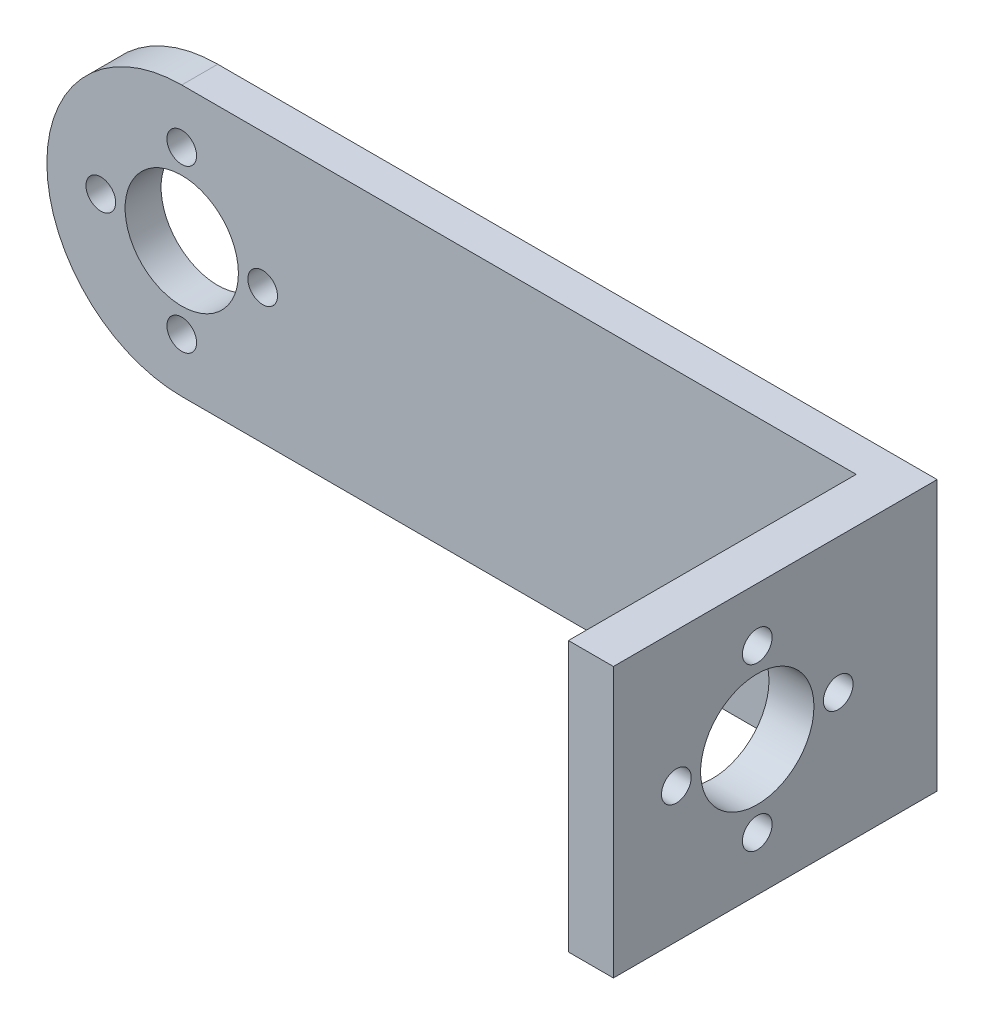
ISO-10303-21;
HEADER;
FILE_DESCRIPTION(('STEP AP214'),'2;1');
FILE_NAME('part.step','',(''),(''),'','','');
FILE_SCHEMA(('AUTOMOTIVE_DESIGN { 1 0 10303 214 1 1 1 1 }'));
ENDSEC;
DATA;
#1=APPLICATION_CONTEXT('core data for automotive mechanical design processes');
#2=APPLICATION_PROTOCOL_DEFINITION('international standard','automotive_design',2000,#1);
#3=PRODUCT_CONTEXT('',#1,'mechanical');
#4=PRODUCT('Part','Part','',(#3));
#5=PRODUCT_RELATED_PRODUCT_CATEGORY('part','',(#4));
#6=PRODUCT_DEFINITION_FORMATION('','',#4);
#7=PRODUCT_DEFINITION_CONTEXT('part definition',#1,'design');
#8=PRODUCT_DEFINITION('design','',#6,#7);
#9=PRODUCT_DEFINITION_SHAPE('','',#8);
#10=(LENGTH_UNIT() NAMED_UNIT(*) SI_UNIT(.MILLI.,.METRE.));
#11=(NAMED_UNIT(*) PLANE_ANGLE_UNIT() SI_UNIT($,.RADIAN.));
#12=(NAMED_UNIT(*) SI_UNIT($,.STERADIAN.) SOLID_ANGLE_UNIT());
#13=UNCERTAINTY_MEASURE_WITH_UNIT(LENGTH_MEASURE(1.E-05),#10,'distance_accuracy_value','');
#14=(GEOMETRIC_REPRESENTATION_CONTEXT(3) GLOBAL_UNCERTAINTY_ASSIGNED_CONTEXT((#13)) GLOBAL_UNIT_ASSIGNED_CONTEXT((#10,
#11,#12)) REPRESENTATION_CONTEXT('',''));
#15=CARTESIAN_POINT('',(0.,0.,0.));
#16=DIRECTION('',(0.,0.,1.));
#17=DIRECTION('',(1.,0.,0.));
#18=AXIS2_PLACEMENT_3D('',#15,#16,#17);
#19=CARTESIAN_POINT('',(0.,0.,4.));
#20=DIRECTION('',(0.,0.,1.));
#21=DIRECTION('',(1.,0.,0.));
#22=AXIS2_PLACEMENT_3D('',#19,#20,#21);
#23=PLANE('',#22);
#24=CARTESIAN_POINT('',(0.,9.,4.));
#25=DIRECTION('',(0.,0.,1.));
#26=DIRECTION('',(1.,0.,0.));
#27=AXIS2_PLACEMENT_3D('',#24,#25,#26);
#28=CIRCLE('',#27,1.65);
#29=CARTESIAN_POINT('',(1.65,9.,4.));
#30=VERTEX_POINT('',#29);
#31=EDGE_CURVE('E99',#30,#30,#28,.T.);
#32=ORIENTED_EDGE('',*,*,#31,.F.);
#33=EDGE_LOOP('',(#32));
#34=FACE_BOUND('',#33,.T.);
#35=CARTESIAN_POINT('',(9.,0.,4.));
#36=DIRECTION('',(0.,0.,1.));
#37=DIRECTION('',(1.,0.,0.));
#38=AXIS2_PLACEMENT_3D('',#35,#36,#37);
#39=CIRCLE('',#38,1.65);
#40=CARTESIAN_POINT('',(10.65,0.,4.));
#41=VERTEX_POINT('',#40);
#42=EDGE_CURVE('E156',#41,#41,#39,.T.);
#43=ORIENTED_EDGE('',*,*,#42,.F.);
#44=EDGE_LOOP('',(#43));
#45=FACE_BOUND('',#44,.T.);
#46=CARTESIAN_POINT('',(0.,-9.,4.));
#47=DIRECTION('',(0.,0.,1.));
#48=DIRECTION('',(1.,0.,0.));
#49=AXIS2_PLACEMENT_3D('',#46,#47,#48);
#50=CIRCLE('',#49,1.65);
#51=CARTESIAN_POINT('',(1.65,-9.,4.));
#52=VERTEX_POINT('',#51);
#53=EDGE_CURVE('E159',#52,#52,#50,.T.);
#54=ORIENTED_EDGE('',*,*,#53,.F.);
#55=EDGE_LOOP('',(#54));
#56=FACE_BOUND('',#55,.T.);
#57=CARTESIAN_POINT('',(0.,0.,4.));
#58=DIRECTION('',(0.,0.,1.));
#59=DIRECTION('',(1.,0.,0.));
#60=AXIS2_PLACEMENT_3D('',#57,#58,#59);
#61=CIRCLE('',#60,6.3);
#62=CARTESIAN_POINT('',(6.3,0.,4.));
#63=VERTEX_POINT('',#62);
#64=EDGE_CURVE('E162',#63,#63,#61,.T.);
#65=ORIENTED_EDGE('',*,*,#64,.F.);
#66=EDGE_LOOP('',(#65));
#67=FACE_BOUND('',#66,.T.);
#68=CARTESIAN_POINT('',(-9.,0.,4.));
#69=DIRECTION('',(0.,0.,1.));
#70=DIRECTION('',(1.,0.,0.));
#71=AXIS2_PLACEMENT_3D('',#68,#69,#70);
#72=CIRCLE('',#71,1.65);
#73=CARTESIAN_POINT('',(-7.35,0.,4.));
#74=VERTEX_POINT('',#73);
#75=EDGE_CURVE('E84',#74,#74,#72,.T.);
#76=ORIENTED_EDGE('',*,*,#75,.F.);
#77=EDGE_LOOP('',(#76));
#78=FACE_BOUND('',#77,.T.);
#79=DIRECTION('',(1.,0.,0.));
#80=VECTOR('',#79,1.);
#81=CARTESIAN_POINT('',(0.,-15.,4.));
#82=LINE('',#81,#80);
#83=CARTESIAN_POINT('',(0.,-15.,4.));
#84=VERTEX_POINT('',#83);
#85=CARTESIAN_POINT('',(75.,-15.,4.));
#86=VERTEX_POINT('',#85);
#87=EDGE_CURVE('E166',#84,#86,#82,.T.);
#88=ORIENTED_EDGE('',*,*,#87,.T.);
#89=DIRECTION('',(0.,1.,0.));
#90=VECTOR('',#89,1.);
#91=CARTESIAN_POINT('',(75.,0.,4.));
#92=LINE('',#91,#90);
#93=CARTESIAN_POINT('',(75.,15.,4.));
#94=VERTEX_POINT('',#93);
#95=EDGE_CURVE('E150',#86,#94,#92,.T.);
#96=ORIENTED_EDGE('',*,*,#95,.T.);
#97=DIRECTION('',(1.,0.,0.));
#98=VECTOR('',#97,1.);
#99=CARTESIAN_POINT('',(0.,15.,4.));
#100=LINE('',#99,#98);
#101=CARTESIAN_POINT('',(0.,15.,4.));
#102=VERTEX_POINT('',#101);
#103=EDGE_CURVE('E169',#102,#94,#100,.T.);
#104=ORIENTED_EDGE('',*,*,#103,.F.);
#105=CARTESIAN_POINT('',(0.,0.,4.));
#106=DIRECTION('',(0.,0.,1.));
#107=DIRECTION('',(1.,0.,0.));
#108=AXIS2_PLACEMENT_3D('',#105,#106,#107);
#109=CIRCLE('',#108,15.);
#110=EDGE_CURVE('E81',#102,#84,#109,.T.);
#111=ORIENTED_EDGE('',*,*,#110,.T.);
#112=EDGE_LOOP('',(#88,#96,#104,#111));
#113=FACE_BOUND('',#112,.T.);
#114=ADVANCED_FACE('F37',(#34,#45,#56,#67,#78,#113),#23,.T.);
#115=CARTESIAN_POINT('',(0.,0.,4.));
#116=DIRECTION('',(0.,0.,-1.));
#117=DIRECTION('',(-1.,0.,0.));
#118=AXIS2_PLACEMENT_3D('',#115,#116,#117);
#119=CYLINDRICAL_SURFACE('',#118,15.);
#120=CARTESIAN_POINT('',(0.,0.,0.));
#121=DIRECTION('',(0.,0.,1.));
#122=DIRECTION('',(1.,0.,0.));
#123=AXIS2_PLACEMENT_3D('',#120,#121,#122);
#124=CIRCLE('',#123,15.);
#125=CARTESIAN_POINT('',(0.,15.,0.));
#126=VERTEX_POINT('',#125);
#127=CARTESIAN_POINT('',(0.,-15.,0.));
#128=VERTEX_POINT('',#127);
#129=EDGE_CURVE('E79',#126,#128,#124,.T.);
#130=ORIENTED_EDGE('',*,*,#129,.T.);
#131=DIRECTION('',(0.,0.,-1.));
#132=VECTOR('',#131,1.);
#133=CARTESIAN_POINT('',(0.,-15.,4.));
#134=LINE('',#133,#132);
#135=EDGE_CURVE('E11',#84,#128,#134,.T.);
#136=ORIENTED_EDGE('',*,*,#135,.F.);
#137=ORIENTED_EDGE('',*,*,#110,.F.);
#138=DIRECTION('',(0.,0.,-1.));
#139=VECTOR('',#138,1.);
#140=CARTESIAN_POINT('',(0.,15.,4.));
#141=LINE('',#140,#139);
#142=EDGE_CURVE('E56',#102,#126,#141,.T.);
#143=ORIENTED_EDGE('',*,*,#142,.T.);
#144=EDGE_LOOP('',(#130,#136,#137,#143));
#145=FACE_BOUND('',#144,.T.);
#146=ADVANCED_FACE('F77',(#145),#119,.T.);
#147=CARTESIAN_POINT('',(0.,-15.,4.));
#148=DIRECTION('',(0.,1.,0.));
#149=DIRECTION('',(-1.,0.,0.));
#150=AXIS2_PLACEMENT_3D('',#147,#148,#149);
#151=PLANE('',#150);
#152=DIRECTION('',(0.,0.,-1.));
#153=VECTOR('',#152,1.);
#154=CARTESIAN_POINT('',(80.,-15.,4.));
#155=LINE('',#154,#153);
#156=CARTESIAN_POINT('',(80.,-15.,36.));
#157=VERTEX_POINT('',#156);
#158=CARTESIAN_POINT('',(80.,-15.,0.));
#159=VERTEX_POINT('',#158);
#160=EDGE_CURVE('E47',#157,#159,#155,.T.);
#161=ORIENTED_EDGE('',*,*,#160,.F.);
#162=DIRECTION('',(1.,0.,0.));
#163=VECTOR('',#162,1.);
#164=CARTESIAN_POINT('',(80.,-15.,36.));
#165=LINE('',#164,#163);
#166=CARTESIAN_POINT('',(75.,-15.,36.));
#167=VERTEX_POINT('',#166);
#168=EDGE_CURVE('E138',#167,#157,#165,.T.);
#169=ORIENTED_EDGE('',*,*,#168,.F.);
#170=DIRECTION('',(0.,0.,-1.));
#171=VECTOR('',#170,1.);
#172=CARTESIAN_POINT('',(75.,-15.,36.));
#173=LINE('',#172,#171);
#174=EDGE_CURVE('E144',#167,#86,#173,.T.);
#175=ORIENTED_EDGE('',*,*,#174,.T.);
#176=ORIENTED_EDGE('',*,*,#87,.F.);
#177=ORIENTED_EDGE('',*,*,#135,.T.);
#178=DIRECTION('',(1.,0.,0.));
#179=VECTOR('',#178,1.);
#180=CARTESIAN_POINT('',(0.,-15.,0.));
#181=LINE('',#180,#179);
#182=EDGE_CURVE('E88',#128,#159,#181,.T.);
#183=ORIENTED_EDGE('',*,*,#182,.T.);
#184=EDGE_LOOP('',(#161,#169,#175,#176,#177,#183));
#185=FACE_BOUND('',#184,.T.);
#186=ADVANCED_FACE('F184',(#185),#151,.F.);
#187=CARTESIAN_POINT('',(80.,0.,4.));
#188=DIRECTION('',(1.,0.,0.));
#189=DIRECTION('',(0.,0.,-1.));
#190=AXIS2_PLACEMENT_3D('',#187,#188,#189);
#191=PLANE('',#190);
#192=CARTESIAN_POINT('',(80.,0.,11.));
#193=DIRECTION('',(1.,0.,0.));
#194=DIRECTION('',(0.,0.,-1.));
#195=AXIS2_PLACEMENT_3D('',#192,#193,#194);
#196=CIRCLE('',#195,1.65);
#197=CARTESIAN_POINT('',(80.,0.,9.35));
#198=VERTEX_POINT('',#197);
#199=EDGE_CURVE('E429',#198,#198,#196,.T.);
#200=ORIENTED_EDGE('',*,*,#199,.F.);
#201=EDGE_LOOP('',(#200));
#202=FACE_BOUND('',#201,.T.);
#203=CARTESIAN_POINT('',(80.,-8.99999999999999,20.));
#204=DIRECTION('',(1.,0.,0.));
#205=DIRECTION('',(0.,0.,-1.));
#206=AXIS2_PLACEMENT_3D('',#203,#204,#205);
#207=CIRCLE('',#206,1.65);
#208=CARTESIAN_POINT('',(80.,-8.99999999999999,18.35));
#209=VERTEX_POINT('',#208);
#210=EDGE_CURVE('E430',#209,#209,#207,.T.);
#211=ORIENTED_EDGE('',*,*,#210,.F.);
#212=EDGE_LOOP('',(#211));
#213=FACE_BOUND('',#212,.T.);
#214=CARTESIAN_POINT('',(80.,0.,29.));
#215=DIRECTION('',(1.,0.,0.));
#216=DIRECTION('',(0.,0.,-1.));
#217=AXIS2_PLACEMENT_3D('',#214,#215,#216);
#218=CIRCLE('',#217,1.65);
#219=CARTESIAN_POINT('',(80.,0.,27.35));
#220=VERTEX_POINT('',#219);
#221=EDGE_CURVE('E131',#220,#220,#218,.T.);
#222=ORIENTED_EDGE('',*,*,#221,.F.);
#223=EDGE_LOOP('',(#222));
#224=FACE_BOUND('',#223,.T.);
#225=CARTESIAN_POINT('',(80.,0.,20.));
#226=DIRECTION('',(1.,0.,0.));
#227=DIRECTION('',(0.,0.,-1.));
#228=AXIS2_PLACEMENT_3D('',#225,#226,#227);
#229=CIRCLE('',#228,6.3);
#230=CARTESIAN_POINT('',(80.,0.,13.7));
#231=VERTEX_POINT('',#230);
#232=EDGE_CURVE('E116',#231,#231,#229,.T.);
#233=ORIENTED_EDGE('',*,*,#232,.F.);
#234=EDGE_LOOP('',(#233));
#235=FACE_BOUND('',#234,.T.);
#236=CARTESIAN_POINT('',(80.,9.00000000000001,20.));
#237=DIRECTION('',(1.,0.,0.));
#238=DIRECTION('',(0.,0.,-1.));
#239=AXIS2_PLACEMENT_3D('',#236,#237,#238);
#240=CIRCLE('',#239,1.65);
#241=CARTESIAN_POINT('',(80.,9.00000000000001,18.35));
#242=VERTEX_POINT('',#241);
#243=EDGE_CURVE('E111',#242,#242,#240,.T.);
#244=ORIENTED_EDGE('',*,*,#243,.F.);
#245=EDGE_LOOP('',(#244));
#246=FACE_BOUND('',#245,.T.);
#247=DIRECTION('',(0.,-1.,0.));
#248=VECTOR('',#247,1.);
#249=CARTESIAN_POINT('',(80.,0.,0.));
#250=LINE('',#249,#248);
#251=CARTESIAN_POINT('',(80.,15.,0.));
#252=VERTEX_POINT('',#251);
#253=EDGE_CURVE('E96',#252,#159,#250,.T.);
#254=ORIENTED_EDGE('',*,*,#253,.F.);
#255=DIRECTION('',(0.,0.,-1.));
#256=VECTOR('',#255,1.);
#257=CARTESIAN_POINT('',(80.,15.,4.));
#258=LINE('',#257,#256);
#259=CARTESIAN_POINT('',(80.,15.,36.));
#260=VERTEX_POINT('',#259);
#261=EDGE_CURVE('E83',#260,#252,#258,.T.);
#262=ORIENTED_EDGE('',*,*,#261,.F.);
#263=DIRECTION('',(0.,1.,0.));
#264=VECTOR('',#263,1.);
#265=CARTESIAN_POINT('',(80.,15.,36.));
#266=LINE('',#265,#264);
#267=EDGE_CURVE('E141',#157,#260,#266,.T.);
#268=ORIENTED_EDGE('',*,*,#267,.F.);
#269=ORIENTED_EDGE('',*,*,#160,.T.);
#270=EDGE_LOOP('',(#254,#262,#268,#269));
#271=FACE_BOUND('',#270,.T.);
#272=ADVANCED_FACE('F189',(#202,#213,#224,#235,#246,#271),#191,.T.);
#273=CARTESIAN_POINT('',(0.,15.,4.));
#274=DIRECTION('',(0.,1.,0.));
#275=DIRECTION('',(-1.,0.,0.));
#276=AXIS2_PLACEMENT_3D('',#273,#274,#275);
#277=PLANE('',#276);
#278=ORIENTED_EDGE('',*,*,#261,.T.);
#279=DIRECTION('',(1.,0.,0.));
#280=VECTOR('',#279,1.);
#281=CARTESIAN_POINT('',(0.,15.,0.));
#282=LINE('',#281,#280);
#283=EDGE_CURVE('E73',#126,#252,#282,.T.);
#284=ORIENTED_EDGE('',*,*,#283,.F.);
#285=ORIENTED_EDGE('',*,*,#142,.F.);
#286=ORIENTED_EDGE('',*,*,#103,.T.);
#287=DIRECTION('',(0.,0.,-1.));
#288=VECTOR('',#287,1.);
#289=CARTESIAN_POINT('',(75.,15.,36.));
#290=LINE('',#289,#288);
#291=CARTESIAN_POINT('',(75.,15.,36.));
#292=VERTEX_POINT('',#291);
#293=EDGE_CURVE('E147',#292,#94,#290,.T.);
#294=ORIENTED_EDGE('',*,*,#293,.F.);
#295=DIRECTION('',(-1.,0.,0.));
#296=VECTOR('',#295,1.);
#297=CARTESIAN_POINT('',(80.,15.,36.));
#298=LINE('',#297,#296);
#299=EDGE_CURVE('E110',#260,#292,#298,.T.);
#300=ORIENTED_EDGE('',*,*,#299,.F.);
#301=EDGE_LOOP('',(#278,#284,#285,#286,#294,#300));
#302=FACE_BOUND('',#301,.T.);
#303=ADVANCED_FACE('F91',(#302),#277,.T.);
#304=CARTESIAN_POINT('',(0.,0.,4.));
#305=DIRECTION('',(0.,0.,-1.));
#306=DIRECTION('',(-1.,0.,0.));
#307=AXIS2_PLACEMENT_3D('',#304,#305,#306);
#308=CYLINDRICAL_SURFACE('',#307,6.3);
#309=ORIENTED_EDGE('',*,*,#64,.T.);
#310=EDGE_LOOP('',(#309));
#311=FACE_BOUND('',#310,.T.);
#312=CARTESIAN_POINT('',(0.,0.,0.));
#313=DIRECTION('',(0.,0.,1.));
#314=DIRECTION('',(1.,0.,0.));
#315=AXIS2_PLACEMENT_3D('',#312,#313,#314);
#316=CIRCLE('',#315,6.3);
#317=CARTESIAN_POINT('',(6.3,0.,0.));
#318=VERTEX_POINT('',#317);
#319=EDGE_CURVE('E89',#318,#318,#316,.T.);
#320=ORIENTED_EDGE('',*,*,#319,.F.);
#321=EDGE_LOOP('',(#320));
#322=FACE_BOUND('',#321,.T.);
#323=ADVANCED_FACE('F228',(#311,#322),#308,.F.);
#324=CARTESIAN_POINT('',(0.,-9.,4.));
#325=DIRECTION('',(0.,0.,-1.));
#326=DIRECTION('',(-1.,0.,0.));
#327=AXIS2_PLACEMENT_3D('',#324,#325,#326);
#328=CYLINDRICAL_SURFACE('',#327,1.65);
#329=ORIENTED_EDGE('',*,*,#53,.T.);
#330=EDGE_LOOP('',(#329));
#331=FACE_BOUND('',#330,.T.);
#332=CARTESIAN_POINT('',(0.,-9.,0.));
#333=DIRECTION('',(0.,0.,1.));
#334=DIRECTION('',(1.,0.,0.));
#335=AXIS2_PLACEMENT_3D('',#332,#333,#334);
#336=CIRCLE('',#335,1.65);
#337=CARTESIAN_POINT('',(1.65,-9.,0.));
#338=VERTEX_POINT('',#337);
#339=EDGE_CURVE('E178',#338,#338,#336,.T.);
#340=ORIENTED_EDGE('',*,*,#339,.F.);
#341=EDGE_LOOP('',(#340));
#342=FACE_BOUND('',#341,.T.);
#343=ADVANCED_FACE('F236',(#331,#342),#328,.F.);
#344=CARTESIAN_POINT('',(9.,0.,4.));
#345=DIRECTION('',(0.,0.,-1.));
#346=DIRECTION('',(-1.,0.,0.));
#347=AXIS2_PLACEMENT_3D('',#344,#345,#346);
#348=CYLINDRICAL_SURFACE('',#347,1.65);
#349=ORIENTED_EDGE('',*,*,#42,.T.);
#350=EDGE_LOOP('',(#349));
#351=FACE_BOUND('',#350,.T.);
#352=CARTESIAN_POINT('',(9.,0.,0.));
#353=DIRECTION('',(0.,0.,1.));
#354=DIRECTION('',(1.,0.,0.));
#355=AXIS2_PLACEMENT_3D('',#352,#353,#354);
#356=CIRCLE('',#355,1.65);
#357=CARTESIAN_POINT('',(10.65,0.,0.));
#358=VERTEX_POINT('',#357);
#359=EDGE_CURVE('E175',#358,#358,#356,.T.);
#360=ORIENTED_EDGE('',*,*,#359,.F.);
#361=EDGE_LOOP('',(#360));
#362=FACE_BOUND('',#361,.T.);
#363=ADVANCED_FACE('F239',(#351,#362),#348,.F.);
#364=CARTESIAN_POINT('',(0.,9.,4.));
#365=DIRECTION('',(0.,0.,-1.));
#366=DIRECTION('',(-1.,0.,0.));
#367=AXIS2_PLACEMENT_3D('',#364,#365,#366);
#368=CYLINDRICAL_SURFACE('',#367,1.65);
#369=ORIENTED_EDGE('',*,*,#31,.T.);
#370=EDGE_LOOP('',(#369));
#371=FACE_BOUND('',#370,.T.);
#372=CARTESIAN_POINT('',(0.,9.,0.));
#373=DIRECTION('',(0.,0.,1.));
#374=DIRECTION('',(1.,0.,0.));
#375=AXIS2_PLACEMENT_3D('',#372,#373,#374);
#376=CIRCLE('',#375,1.65);
#377=CARTESIAN_POINT('',(1.65,9.,0.));
#378=VERTEX_POINT('',#377);
#379=EDGE_CURVE('E153',#378,#378,#376,.T.);
#380=ORIENTED_EDGE('',*,*,#379,.F.);
#381=EDGE_LOOP('',(#380));
#382=FACE_BOUND('',#381,.T.);
#383=ADVANCED_FACE('F39',(#371,#382),#368,.F.);
#384=CARTESIAN_POINT('',(-9.,0.,4.));
#385=DIRECTION('',(0.,0.,-1.));
#386=DIRECTION('',(-1.,0.,0.));
#387=AXIS2_PLACEMENT_3D('',#384,#385,#386);
#388=CYLINDRICAL_SURFACE('',#387,1.65);
#389=ORIENTED_EDGE('',*,*,#75,.T.);
#390=EDGE_LOOP('',(#389));
#391=FACE_BOUND('',#390,.T.);
#392=CARTESIAN_POINT('',(-9.,0.,0.));
#393=DIRECTION('',(0.,0.,1.));
#394=DIRECTION('',(1.,0.,0.));
#395=AXIS2_PLACEMENT_3D('',#392,#393,#394);
#396=CIRCLE('',#395,1.65);
#397=CARTESIAN_POINT('',(-7.35,0.,0.));
#398=VERTEX_POINT('',#397);
#399=EDGE_CURVE('E95',#398,#398,#396,.T.);
#400=ORIENTED_EDGE('',*,*,#399,.F.);
#401=EDGE_LOOP('',(#400));
#402=FACE_BOUND('',#401,.T.);
#403=ADVANCED_FACE('F222',(#391,#402),#388,.F.);
#404=CARTESIAN_POINT('',(0.,0.,0.));
#405=DIRECTION('',(0.,0.,1.));
#406=DIRECTION('',(1.,0.,0.));
#407=AXIS2_PLACEMENT_3D('',#404,#405,#406);
#408=PLANE('',#407);
#409=ORIENTED_EDGE('',*,*,#253,.T.);
#410=ORIENTED_EDGE('',*,*,#182,.F.);
#411=ORIENTED_EDGE('',*,*,#129,.F.);
#412=ORIENTED_EDGE('',*,*,#283,.T.);
#413=EDGE_LOOP('',(#409,#410,#411,#412));
#414=FACE_BOUND('',#413,.T.);
#415=ORIENTED_EDGE('',*,*,#399,.T.);
#416=EDGE_LOOP('',(#415));
#417=FACE_BOUND('',#416,.T.);
#418=ORIENTED_EDGE('',*,*,#319,.T.);
#419=EDGE_LOOP('',(#418));
#420=FACE_BOUND('',#419,.T.);
#421=ORIENTED_EDGE('',*,*,#339,.T.);
#422=EDGE_LOOP('',(#421));
#423=FACE_BOUND('',#422,.T.);
#424=ORIENTED_EDGE('',*,*,#359,.T.);
#425=EDGE_LOOP('',(#424));
#426=FACE_BOUND('',#425,.T.);
#427=ORIENTED_EDGE('',*,*,#379,.T.);
#428=EDGE_LOOP('',(#427));
#429=FACE_BOUND('',#428,.T.);
#430=ADVANCED_FACE('F86',(#414,#417,#420,#423,#426,#429),#408,.F.);
#431=CARTESIAN_POINT('',(75.,15.,36.));
#432=DIRECTION('',(1.,0.,0.));
#433=DIRECTION('',(0.,0.,-1.));
#434=AXIS2_PLACEMENT_3D('',#431,#432,#433);
#435=PLANE('',#434);
#436=CARTESIAN_POINT('',(75.,0.,11.));
#437=DIRECTION('',(1.,0.,0.));
#438=DIRECTION('',(0.,0.,-1.));
#439=AXIS2_PLACEMENT_3D('',#436,#437,#438);
#440=CIRCLE('',#439,1.65);
#441=CARTESIAN_POINT('',(75.,0.,9.35));
#442=VERTEX_POINT('',#441);
#443=EDGE_CURVE('E41',#442,#442,#440,.T.);
#444=ORIENTED_EDGE('',*,*,#443,.T.);
#445=EDGE_LOOP('',(#444));
#446=FACE_BOUND('',#445,.T.);
#447=CARTESIAN_POINT('',(75.,-8.99999999999999,20.));
#448=DIRECTION('',(1.,0.,0.));
#449=DIRECTION('',(0.,0.,-1.));
#450=AXIS2_PLACEMENT_3D('',#447,#448,#449);
#451=CIRCLE('',#450,1.65);
#452=CARTESIAN_POINT('',(75.,-8.99999999999999,18.35));
#453=VERTEX_POINT('',#452);
#454=EDGE_CURVE('E118',#453,#453,#451,.T.);
#455=ORIENTED_EDGE('',*,*,#454,.T.);
#456=EDGE_LOOP('',(#455));
#457=FACE_BOUND('',#456,.T.);
#458=CARTESIAN_POINT('',(75.,0.,29.));
#459=DIRECTION('',(1.,0.,0.));
#460=DIRECTION('',(0.,0.,-1.));
#461=AXIS2_PLACEMENT_3D('',#458,#459,#460);
#462=CIRCLE('',#461,1.65);
#463=CARTESIAN_POINT('',(75.,0.,27.35));
#464=VERTEX_POINT('',#463);
#465=EDGE_CURVE('E115',#464,#464,#462,.T.);
#466=ORIENTED_EDGE('',*,*,#465,.T.);
#467=EDGE_LOOP('',(#466));
#468=FACE_BOUND('',#467,.T.);
#469=CARTESIAN_POINT('',(75.,0.,20.));
#470=DIRECTION('',(1.,0.,0.));
#471=DIRECTION('',(0.,0.,-1.));
#472=AXIS2_PLACEMENT_3D('',#469,#470,#471);
#473=CIRCLE('',#472,6.3);
#474=CARTESIAN_POINT('',(75.,0.,13.7));
#475=VERTEX_POINT('',#474);
#476=EDGE_CURVE('E112',#475,#475,#473,.T.);
#477=ORIENTED_EDGE('',*,*,#476,.T.);
#478=EDGE_LOOP('',(#477));
#479=FACE_BOUND('',#478,.T.);
#480=CARTESIAN_POINT('',(75.,9.00000000000001,20.));
#481=DIRECTION('',(1.,0.,0.));
#482=DIRECTION('',(0.,0.,-1.));
#483=AXIS2_PLACEMENT_3D('',#480,#481,#482);
#484=CIRCLE('',#483,1.65);
#485=CARTESIAN_POINT('',(75.,9.00000000000001,18.35));
#486=VERTEX_POINT('',#485);
#487=EDGE_CURVE('E107',#486,#486,#484,.T.);
#488=ORIENTED_EDGE('',*,*,#487,.T.);
#489=EDGE_LOOP('',(#488));
#490=FACE_BOUND('',#489,.T.);
#491=ORIENTED_EDGE('',*,*,#95,.F.);
#492=ORIENTED_EDGE('',*,*,#174,.F.);
#493=DIRECTION('',(0.,-1.,0.));
#494=VECTOR('',#493,1.);
#495=CARTESIAN_POINT('',(75.,15.,36.));
#496=LINE('',#495,#494);
#497=EDGE_CURVE('E135',#292,#167,#496,.T.);
#498=ORIENTED_EDGE('',*,*,#497,.F.);
#499=ORIENTED_EDGE('',*,*,#293,.T.);
#500=EDGE_LOOP('',(#491,#492,#498,#499));
#501=FACE_BOUND('',#500,.T.);
#502=ADVANCED_FACE('F203',(#446,#457,#468,#479,#490,#501),#435,.F.);
#503=CARTESIAN_POINT('',(0.,0.,36.));
#504=DIRECTION('',(0.,0.,1.));
#505=DIRECTION('',(1.,0.,0.));
#506=AXIS2_PLACEMENT_3D('',#503,#504,#505);
#507=PLANE('',#506);
#508=ORIENTED_EDGE('',*,*,#299,.T.);
#509=ORIENTED_EDGE('',*,*,#497,.T.);
#510=ORIENTED_EDGE('',*,*,#168,.T.);
#511=ORIENTED_EDGE('',*,*,#267,.T.);
#512=EDGE_LOOP('',(#508,#509,#510,#511));
#513=FACE_BOUND('',#512,.T.);
#514=ADVANCED_FACE('F194',(#513),#507,.T.);
#515=CARTESIAN_POINT('',(46.,9.00000000000001,20.));
#516=DIRECTION('',(1.,0.,0.));
#517=DIRECTION('',(0.,0.,-1.));
#518=AXIS2_PLACEMENT_3D('',#515,#516,#517);
#519=CYLINDRICAL_SURFACE('',#518,1.65);
#520=ORIENTED_EDGE('',*,*,#243,.T.);
#521=EDGE_LOOP('',(#520));
#522=FACE_BOUND('',#521,.T.);
#523=ORIENTED_EDGE('',*,*,#487,.F.);
#524=EDGE_LOOP('',(#523));
#525=FACE_BOUND('',#524,.T.);
#526=ADVANCED_FACE('F292',(#522,#525),#519,.F.);
#527=CARTESIAN_POINT('',(46.,0.,20.));
#528=DIRECTION('',(1.,0.,0.));
#529=DIRECTION('',(0.,0.,-1.));
#530=AXIS2_PLACEMENT_3D('',#527,#528,#529);
#531=CYLINDRICAL_SURFACE('',#530,6.3);
#532=ORIENTED_EDGE('',*,*,#232,.T.);
#533=EDGE_LOOP('',(#532));
#534=FACE_BOUND('',#533,.T.);
#535=ORIENTED_EDGE('',*,*,#476,.F.);
#536=EDGE_LOOP('',(#535));
#537=FACE_BOUND('',#536,.T.);
#538=ADVANCED_FACE('F297',(#534,#537),#531,.F.);
#539=CARTESIAN_POINT('',(46.,0.,29.));
#540=DIRECTION('',(1.,0.,0.));
#541=DIRECTION('',(0.,0.,-1.));
#542=AXIS2_PLACEMENT_3D('',#539,#540,#541);
#543=CYLINDRICAL_SURFACE('',#542,1.65);
#544=ORIENTED_EDGE('',*,*,#221,.T.);
#545=EDGE_LOOP('',(#544));
#546=FACE_BOUND('',#545,.T.);
#547=ORIENTED_EDGE('',*,*,#465,.F.);
#548=EDGE_LOOP('',(#547));
#549=FACE_BOUND('',#548,.T.);
#550=ADVANCED_FACE('F304',(#546,#549),#543,.F.);
#551=CARTESIAN_POINT('',(46.,-8.99999999999999,20.));
#552=DIRECTION('',(1.,0.,0.));
#553=DIRECTION('',(0.,0.,-1.));
#554=AXIS2_PLACEMENT_3D('',#551,#552,#553);
#555=CYLINDRICAL_SURFACE('',#554,1.65);
#556=ORIENTED_EDGE('',*,*,#210,.T.);
#557=EDGE_LOOP('',(#556));
#558=FACE_BOUND('',#557,.T.);
#559=ORIENTED_EDGE('',*,*,#454,.F.);
#560=EDGE_LOOP('',(#559));
#561=FACE_BOUND('',#560,.T.);
#562=ADVANCED_FACE('F312',(#558,#561),#555,.F.);
#563=CARTESIAN_POINT('',(46.,0.,11.));
#564=DIRECTION('',(1.,0.,0.));
#565=DIRECTION('',(0.,0.,-1.));
#566=AXIS2_PLACEMENT_3D('',#563,#564,#565);
#567=CYLINDRICAL_SURFACE('',#566,1.65);
#568=ORIENTED_EDGE('',*,*,#199,.T.);
#569=EDGE_LOOP('',(#568));
#570=FACE_BOUND('',#569,.T.);
#571=ORIENTED_EDGE('',*,*,#443,.F.);
#572=EDGE_LOOP('',(#571));
#573=FACE_BOUND('',#572,.T.);
#574=ADVANCED_FACE('F320',(#570,#573),#567,.F.);
#575=CLOSED_SHELL('',(#114,#146,#186,#272,#303,#323,#343,#363,#383,#403,#430,#502,#514,#526,
#538,#550,#562,#574));
#576=MANIFOLD_SOLID_BREP('B2',#575);
#577=ADVANCED_BREP_SHAPE_REPRESENTATION('',(#18,#576),#14);
#578=SHAPE_DEFINITION_REPRESENTATION(#9,#577);
ENDSEC;
END-ISO-10303-21;
